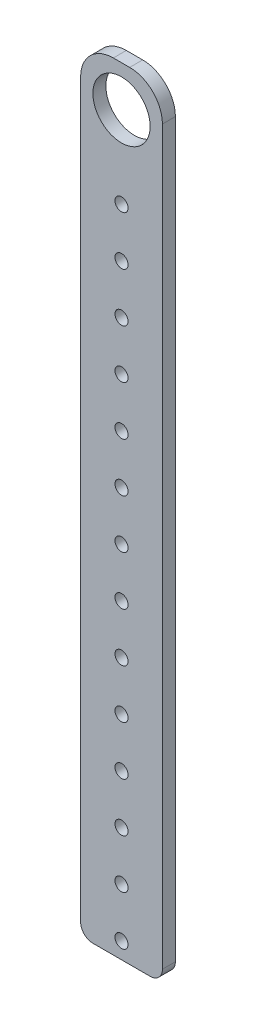
ISO-10303-21;
HEADER;
FILE_DESCRIPTION(('STEP AP214'),'2;1');
FILE_NAME('part.step','',(''),(''),'','','');
FILE_SCHEMA(('AUTOMOTIVE_DESIGN { 1 0 10303 214 1 1 1 1 }'));
ENDSEC;
DATA;
#1=APPLICATION_CONTEXT('core data for automotive mechanical design processes');
#2=APPLICATION_PROTOCOL_DEFINITION('international standard','automotive_design',2000,#1);
#3=PRODUCT_CONTEXT('',#1,'mechanical');
#4=PRODUCT('Part','Part','',(#3));
#5=PRODUCT_RELATED_PRODUCT_CATEGORY('part','',(#4));
#6=PRODUCT_DEFINITION_FORMATION('','',#4);
#7=PRODUCT_DEFINITION_CONTEXT('part definition',#1,'design');
#8=PRODUCT_DEFINITION('design','',#6,#7);
#9=PRODUCT_DEFINITION_SHAPE('','',#8);
#10=(LENGTH_UNIT() NAMED_UNIT(*) SI_UNIT(.MILLI.,.METRE.));
#11=(NAMED_UNIT(*) PLANE_ANGLE_UNIT() SI_UNIT($,.RADIAN.));
#12=(NAMED_UNIT(*) SI_UNIT($,.STERADIAN.) SOLID_ANGLE_UNIT());
#13=UNCERTAINTY_MEASURE_WITH_UNIT(LENGTH_MEASURE(1.E-05),#10,'distance_accuracy_value','');
#14=(GEOMETRIC_REPRESENTATION_CONTEXT(3) GLOBAL_UNCERTAINTY_ASSIGNED_CONTEXT((#13)) GLOBAL_UNIT_ASSIGNED_CONTEXT((#10,
#11,#12)) REPRESENTATION_CONTEXT('',''));
#15=CARTESIAN_POINT('',(0.,0.,0.));
#16=DIRECTION('',(0.,0.,1.));
#17=DIRECTION('',(1.,0.,0.));
#18=AXIS2_PLACEMENT_3D('',#15,#16,#17);
#19=CARTESIAN_POINT('',(0.,0.,3.175));
#20=DIRECTION('',(0.,0.,-1.));
#21=DIRECTION('',(-1.,0.,0.));
#22=AXIS2_PLACEMENT_3D('',#19,#20,#21);
#23=PLANE('',#22);
#24=DIRECTION('',(0.,1.,0.));
#25=VECTOR('',#24,1.);
#26=CARTESIAN_POINT('',(9.99999999999996,-95.0000000000001,3.175));
#27=LINE('',#26,#25);
#28=CARTESIAN_POINT('',(9.99999999999996,-92.0000000000001,3.175));
#29=VERTEX_POINT('',#28);
#30=CARTESIAN_POINT('',(10.,86.9999999999999,3.175));
#31=VERTEX_POINT('',#30);
#32=EDGE_CURVE('E130',#29,#31,#27,.T.);
#33=ORIENTED_EDGE('',*,*,#32,.T.);
#34=CARTESIAN_POINT('',(2.00000000000002,86.9999999999999,3.175));
#35=DIRECTION('',(0.,0.,-1.));
#36=DIRECTION('',(-1.,0.,0.));
#37=AXIS2_PLACEMENT_3D('',#34,#35,#36);
#38=CIRCLE('',#37,8.);
#39=CARTESIAN_POINT('',(2.00000000000001,94.9999999999999,3.175));
#40=VERTEX_POINT('',#39);
#41=EDGE_CURVE('E54',#31,#40,#38,.F.);
#42=ORIENTED_EDGE('',*,*,#41,.T.);
#43=DIRECTION('',(-1.,0.,0.));
#44=VECTOR('',#43,1.);
#45=CARTESIAN_POINT('',(-10.,94.9999999999999,3.175));
#46=LINE('',#45,#44);
#47=CARTESIAN_POINT('',(-2.00000000000002,94.9999999999999,3.175));
#48=VERTEX_POINT('',#47);
#49=EDGE_CURVE('E195',#40,#48,#46,.T.);
#50=ORIENTED_EDGE('',*,*,#49,.T.);
#51=CARTESIAN_POINT('',(-2.00000000000002,86.9999999999999,3.175));
#52=DIRECTION('',(0.,0.,-1.));
#53=DIRECTION('',(-1.,0.,0.));
#54=AXIS2_PLACEMENT_3D('',#51,#52,#53);
#55=CIRCLE('',#54,8.);
#56=CARTESIAN_POINT('',(-10.,86.9999999999999,3.175));
#57=VERTEX_POINT('',#56);
#58=EDGE_CURVE('E61',#48,#57,#55,.F.);
#59=ORIENTED_EDGE('',*,*,#58,.T.);
#60=DIRECTION('',(0.,-1.,0.));
#61=VECTOR('',#60,1.);
#62=CARTESIAN_POINT('',(-10.,-95.0000000000001,3.175));
#63=LINE('',#62,#61);
#64=CARTESIAN_POINT('',(-10.,-92.0000000000001,3.175));
#65=VERTEX_POINT('',#64);
#66=EDGE_CURVE('E202',#57,#65,#63,.T.);
#67=ORIENTED_EDGE('',*,*,#66,.T.);
#68=CARTESIAN_POINT('',(-7.00000000000004,-92.0000000000001,3.175));
#69=DIRECTION('',(0.,0.,-1.));
#70=DIRECTION('',(-1.,0.,0.));
#71=AXIS2_PLACEMENT_3D('',#68,#69,#70);
#72=CIRCLE('',#71,3.);
#73=CARTESIAN_POINT('',(-7.00000000000004,-95.0000000000001,3.175));
#74=VERTEX_POINT('',#73);
#75=EDGE_CURVE('E166',#65,#74,#72,.F.);
#76=ORIENTED_EDGE('',*,*,#75,.T.);
#77=DIRECTION('',(1.,0.,0.));
#78=VECTOR('',#77,1.);
#79=CARTESIAN_POINT('',(-10.,-95.0000000000001,3.175));
#80=LINE('',#79,#78);
#81=CARTESIAN_POINT('',(6.99999999999996,-95.0000000000001,3.175));
#82=VERTEX_POINT('',#81);
#83=EDGE_CURVE('E132',#74,#82,#80,.T.);
#84=ORIENTED_EDGE('',*,*,#83,.T.);
#85=CARTESIAN_POINT('',(6.99999999999996,-92.0000000000001,3.175));
#86=DIRECTION('',(0.,0.,-1.));
#87=DIRECTION('',(-1.,0.,0.));
#88=AXIS2_PLACEMENT_3D('',#85,#86,#87);
#89=CIRCLE('',#88,3.);
#90=EDGE_CURVE('E169',#82,#29,#89,.F.);
#91=ORIENTED_EDGE('',*,*,#90,.T.);
#92=EDGE_LOOP('',(#33,#42,#50,#59,#67,#76,#84,#91));
#93=FACE_BOUND('',#92,.T.);
#94=CARTESIAN_POINT('',(0.,84.9999999999999,3.175));
#95=DIRECTION('',(0.,0.,1.));
#96=DIRECTION('',(1.,0.,0.));
#97=AXIS2_PLACEMENT_3D('',#94,#95,#96);
#98=CIRCLE('',#97,7.);
#99=CARTESIAN_POINT('',(7.,84.9999999999999,3.175));
#100=VERTEX_POINT('',#99);
#101=EDGE_CURVE('E140',#100,#100,#98,.T.);
#102=ORIENTED_EDGE('',*,*,#101,.F.);
#103=EDGE_LOOP('',(#102));
#104=FACE_BOUND('',#103,.T.);
#105=CARTESIAN_POINT('',(-2.65589510718706E-13,-7.0000000000001,3.175));
#106=DIRECTION('',(0.,0.,1.));
#107=DIRECTION('',(1.,0.,0.));
#108=AXIS2_PLACEMENT_3D('',#105,#106,#107);
#109=CIRCLE('',#108,1.6);
#110=CARTESIAN_POINT('',(1.59999999999973,-7.0000000000001,3.175));
#111=VERTEX_POINT('',#110);
#112=EDGE_CURVE('E306',#111,#111,#109,.T.);
#113=ORIENTED_EDGE('',*,*,#112,.F.);
#114=EDGE_LOOP('',(#113));
#115=FACE_BOUND('',#114,.T.);
#116=CARTESIAN_POINT('',(-2.24426522732077E-13,-19.0000000000001,3.175));
#117=DIRECTION('',(0.,0.,1.));
#118=DIRECTION('',(1.,0.,0.));
#119=AXIS2_PLACEMENT_3D('',#116,#117,#118);
#120=CIRCLE('',#119,1.6);
#121=CARTESIAN_POINT('',(1.59999999999977,-19.0000000000001,3.175));
#122=VERTEX_POINT('',#121);
#123=EDGE_CURVE('E312',#122,#122,#120,.T.);
#124=ORIENTED_EDGE('',*,*,#123,.F.);
#125=EDGE_LOOP('',(#124));
#126=FACE_BOUND('',#125,.T.);
#127=CARTESIAN_POINT('',(-3.06752498705335E-13,4.99999999999989,3.175));
#128=DIRECTION('',(0.,0.,1.));
#129=DIRECTION('',(1.,0.,0.));
#130=AXIS2_PLACEMENT_3D('',#127,#128,#129);
#131=CIRCLE('',#130,1.6);
#132=CARTESIAN_POINT('',(1.59999999999969,4.99999999999989,3.175));
#133=VERTEX_POINT('',#132);
#134=EDGE_CURVE('E441',#133,#133,#131,.T.);
#135=ORIENTED_EDGE('',*,*,#134,.F.);
#136=EDGE_LOOP('',(#135));
#137=FACE_BOUND('',#136,.T.);
#138=CARTESIAN_POINT('',(-3.47915486691964E-13,16.9999999999999,3.175));
#139=DIRECTION('',(0.,0.,1.));
#140=DIRECTION('',(1.,0.,0.));
#141=AXIS2_PLACEMENT_3D('',#138,#139,#140);
#142=CIRCLE('',#141,1.6);
#143=CARTESIAN_POINT('',(1.59999999999965,16.9999999999999,3.175));
#144=VERTEX_POINT('',#143);
#145=EDGE_CURVE('E434',#144,#144,#142,.T.);
#146=ORIENTED_EDGE('',*,*,#145,.F.);
#147=EDGE_LOOP('',(#146));
#148=FACE_BOUND('',#147,.T.);
#149=CARTESIAN_POINT('',(-3.89078474678593E-13,28.9999999999999,3.175));
#150=DIRECTION('',(0.,0.,1.));
#151=DIRECTION('',(1.,0.,0.));
#152=AXIS2_PLACEMENT_3D('',#149,#150,#151);
#153=CIRCLE('',#152,1.6);
#154=CARTESIAN_POINT('',(1.59999999999961,28.9999999999999,3.175));
#155=VERTEX_POINT('',#154);
#156=EDGE_CURVE('E427',#155,#155,#153,.T.);
#157=ORIENTED_EDGE('',*,*,#156,.F.);
#158=EDGE_LOOP('',(#157));
#159=FACE_BOUND('',#158,.T.);
#160=CARTESIAN_POINT('',(-4.30241462665223E-13,40.9999999999999,3.175));
#161=DIRECTION('',(0.,0.,1.));
#162=DIRECTION('',(1.,0.,0.));
#163=AXIS2_PLACEMENT_3D('',#160,#161,#162);
#164=CIRCLE('',#163,1.6);
#165=CARTESIAN_POINT('',(1.59999999999957,40.9999999999999,3.175));
#166=VERTEX_POINT('',#165);
#167=EDGE_CURVE('E420',#166,#166,#164,.T.);
#168=ORIENTED_EDGE('',*,*,#167,.F.);
#169=EDGE_LOOP('',(#168));
#170=FACE_BOUND('',#169,.T.);
#171=CARTESIAN_POINT('',(-4.71404450651852E-13,52.9999999999999,3.175));
#172=DIRECTION('',(0.,0.,1.));
#173=DIRECTION('',(1.,0.,0.));
#174=AXIS2_PLACEMENT_3D('',#171,#172,#173);
#175=CIRCLE('',#174,1.6);
#176=CARTESIAN_POINT('',(1.59999999999953,52.9999999999999,3.175));
#177=VERTEX_POINT('',#176);
#178=EDGE_CURVE('E413',#177,#177,#175,.T.);
#179=ORIENTED_EDGE('',*,*,#178,.F.);
#180=EDGE_LOOP('',(#179));
#181=FACE_BOUND('',#180,.T.);
#182=CARTESIAN_POINT('',(-5.12567438638481E-13,64.9999999999999,3.175));
#183=DIRECTION('',(0.,0.,1.));
#184=DIRECTION('',(1.,0.,0.));
#185=AXIS2_PLACEMENT_3D('',#182,#183,#184);
#186=CIRCLE('',#185,1.6);
#187=CARTESIAN_POINT('',(1.59999999999949,64.9999999999999,3.175));
#188=VERTEX_POINT('',#187);
#189=EDGE_CURVE('E406',#188,#188,#186,.T.);
#190=ORIENTED_EDGE('',*,*,#189,.F.);
#191=EDGE_LOOP('',(#190));
#192=FACE_BOUND('',#191,.T.);
#193=CARTESIAN_POINT('',(0.,-91.0000000000001,3.175));
#194=DIRECTION('',(0.,0.,1.));
#195=DIRECTION('',(1.,0.,0.));
#196=AXIS2_PLACEMENT_3D('',#193,#194,#195);
#197=CIRCLE('',#196,1.6);
#198=CARTESIAN_POINT('',(1.60000000000003,-91.0000000000001,3.175));
#199=VERTEX_POINT('',#198);
#200=EDGE_CURVE('E399',#199,#199,#197,.T.);
#201=ORIENTED_EDGE('',*,*,#200,.F.);
#202=EDGE_LOOP('',(#201));
#203=FACE_BOUND('',#202,.T.);
#204=CARTESIAN_POINT('',(0.,-79.0000000000001,3.175));
#205=DIRECTION('',(0.,0.,1.));
#206=DIRECTION('',(1.,0.,0.));
#207=AXIS2_PLACEMENT_3D('',#204,#205,#206);
#208=CIRCLE('',#207,1.6);
#209=CARTESIAN_POINT('',(1.59999999999998,-79.0000000000001,3.175));
#210=VERTEX_POINT('',#209);
#211=EDGE_CURVE('E392',#210,#210,#208,.T.);
#212=ORIENTED_EDGE('',*,*,#211,.F.);
#213=EDGE_LOOP('',(#212));
#214=FACE_BOUND('',#213,.T.);
#215=CARTESIAN_POINT('',(0.,-67.0000000000001,3.175));
#216=DIRECTION('',(0.,0.,1.));
#217=DIRECTION('',(1.,0.,0.));
#218=AXIS2_PLACEMENT_3D('',#215,#216,#217);
#219=CIRCLE('',#218,1.6);
#220=CARTESIAN_POINT('',(1.59999999999994,-67.0000000000001,3.175));
#221=VERTEX_POINT('',#220);
#222=EDGE_CURVE('E385',#221,#221,#219,.T.);
#223=ORIENTED_EDGE('',*,*,#222,.F.);
#224=EDGE_LOOP('',(#223));
#225=FACE_BOUND('',#224,.T.);
#226=CARTESIAN_POINT('',(-1.00937558772189E-13,-55.0000000000001,3.175));
#227=DIRECTION('',(0.,0.,1.));
#228=DIRECTION('',(1.,0.,0.));
#229=AXIS2_PLACEMENT_3D('',#226,#227,#228);
#230=CIRCLE('',#229,1.6);
#231=CARTESIAN_POINT('',(1.5999999999999,-55.0000000000001,3.175));
#232=VERTEX_POINT('',#231);
#233=EDGE_CURVE('E378',#232,#232,#230,.T.);
#234=ORIENTED_EDGE('',*,*,#233,.F.);
#235=EDGE_LOOP('',(#234));
#236=FACE_BOUND('',#235,.T.);
#237=CARTESIAN_POINT('',(-1.42100546758818E-13,-43.0000000000001,3.175));
#238=DIRECTION('',(0.,0.,1.));
#239=DIRECTION('',(1.,0.,0.));
#240=AXIS2_PLACEMENT_3D('',#237,#238,#239);
#241=CIRCLE('',#240,1.6);
#242=CARTESIAN_POINT('',(1.59999999999985,-43.0000000000001,3.175));
#243=VERTEX_POINT('',#242);
#244=EDGE_CURVE('E371',#243,#243,#241,.T.);
#245=ORIENTED_EDGE('',*,*,#244,.F.);
#246=EDGE_LOOP('',(#245));
#247=FACE_BOUND('',#246,.T.);
#248=CARTESIAN_POINT('',(-1.83263534745447E-13,-31.0000000000001,3.175));
#249=DIRECTION('',(0.,0.,1.));
#250=DIRECTION('',(1.,0.,0.));
#251=AXIS2_PLACEMENT_3D('',#248,#249,#250);
#252=CIRCLE('',#251,1.6);
#253=CARTESIAN_POINT('',(1.59999999999982,-31.0000000000001,3.175));
#254=VERTEX_POINT('',#253);
#255=EDGE_CURVE('E365',#254,#254,#252,.T.);
#256=ORIENTED_EDGE('',*,*,#255,.F.);
#257=EDGE_LOOP('',(#256));
#258=FACE_BOUND('',#257,.T.);
#259=ADVANCED_FACE('F45',(#93,#104,#115,#126,#137,#148,#159,#170,#181,#192,#203,#214,#225,#236,
#247,#258),#23,.F.);
#260=CARTESIAN_POINT('',(0.,0.,0.));
#261=DIRECTION('',(0.,0.,-1.));
#262=DIRECTION('',(-1.,0.,0.));
#263=AXIS2_PLACEMENT_3D('',#260,#261,#262);
#264=PLANE('',#263);
#265=CARTESIAN_POINT('',(-1.42100546758818E-13,-43.0000000000001,0.));
#266=DIRECTION('',(0.,0.,1.));
#267=DIRECTION('',(1.,0.,0.));
#268=AXIS2_PLACEMENT_3D('',#265,#266,#267);
#269=CIRCLE('',#268,1.6);
#270=CARTESIAN_POINT('',(1.59999999999985,-43.0000000000001,0.));
#271=VERTEX_POINT('',#270);
#272=EDGE_CURVE('E368',#271,#271,#269,.T.);
#273=ORIENTED_EDGE('',*,*,#272,.T.);
#274=EDGE_LOOP('',(#273));
#275=FACE_BOUND('',#274,.T.);
#276=CARTESIAN_POINT('',(0.,-67.0000000000001,0.));
#277=DIRECTION('',(0.,0.,1.));
#278=DIRECTION('',(1.,0.,0.));
#279=AXIS2_PLACEMENT_3D('',#276,#277,#278);
#280=CIRCLE('',#279,1.6);
#281=CARTESIAN_POINT('',(1.59999999999994,-67.0000000000001,0.));
#282=VERTEX_POINT('',#281);
#283=EDGE_CURVE('E382',#282,#282,#280,.T.);
#284=ORIENTED_EDGE('',*,*,#283,.T.);
#285=EDGE_LOOP('',(#284));
#286=FACE_BOUND('',#285,.T.);
#287=CARTESIAN_POINT('',(0.,-91.0000000000001,0.));
#288=DIRECTION('',(0.,0.,1.));
#289=DIRECTION('',(1.,0.,0.));
#290=AXIS2_PLACEMENT_3D('',#287,#288,#289);
#291=CIRCLE('',#290,1.6);
#292=CARTESIAN_POINT('',(1.60000000000003,-91.0000000000001,0.));
#293=VERTEX_POINT('',#292);
#294=EDGE_CURVE('E396',#293,#293,#291,.T.);
#295=ORIENTED_EDGE('',*,*,#294,.T.);
#296=EDGE_LOOP('',(#295));
#297=FACE_BOUND('',#296,.T.);
#298=CARTESIAN_POINT('',(-4.71404450651852E-13,52.9999999999999,0.));
#299=DIRECTION('',(0.,0.,1.));
#300=DIRECTION('',(1.,0.,0.));
#301=AXIS2_PLACEMENT_3D('',#298,#299,#300);
#302=CIRCLE('',#301,1.6);
#303=CARTESIAN_POINT('',(1.59999999999953,52.9999999999999,0.));
#304=VERTEX_POINT('',#303);
#305=EDGE_CURVE('E410',#304,#304,#302,.T.);
#306=ORIENTED_EDGE('',*,*,#305,.T.);
#307=EDGE_LOOP('',(#306));
#308=FACE_BOUND('',#307,.T.);
#309=CARTESIAN_POINT('',(-3.89078474678593E-13,28.9999999999999,0.));
#310=DIRECTION('',(0.,0.,1.));
#311=DIRECTION('',(1.,0.,0.));
#312=AXIS2_PLACEMENT_3D('',#309,#310,#311);
#313=CIRCLE('',#312,1.6);
#314=CARTESIAN_POINT('',(1.59999999999961,28.9999999999999,0.));
#315=VERTEX_POINT('',#314);
#316=EDGE_CURVE('E424',#315,#315,#313,.T.);
#317=ORIENTED_EDGE('',*,*,#316,.T.);
#318=EDGE_LOOP('',(#317));
#319=FACE_BOUND('',#318,.T.);
#320=CARTESIAN_POINT('',(-3.06752498705335E-13,4.99999999999989,0.));
#321=DIRECTION('',(0.,0.,1.));
#322=DIRECTION('',(1.,0.,0.));
#323=AXIS2_PLACEMENT_3D('',#320,#321,#322);
#324=CIRCLE('',#323,1.6);
#325=CARTESIAN_POINT('',(1.59999999999969,4.99999999999989,0.));
#326=VERTEX_POINT('',#325);
#327=EDGE_CURVE('E438',#326,#326,#324,.T.);
#328=ORIENTED_EDGE('',*,*,#327,.T.);
#329=EDGE_LOOP('',(#328));
#330=FACE_BOUND('',#329,.T.);
#331=CARTESIAN_POINT('',(-2.65589510718706E-13,-7.0000000000001,0.));
#332=DIRECTION('',(0.,0.,1.));
#333=DIRECTION('',(1.,0.,0.));
#334=AXIS2_PLACEMENT_3D('',#331,#332,#333);
#335=CIRCLE('',#334,1.6);
#336=CARTESIAN_POINT('',(1.59999999999973,-7.0000000000001,0.));
#337=VERTEX_POINT('',#336);
#338=EDGE_CURVE('E309',#337,#337,#335,.T.);
#339=ORIENTED_EDGE('',*,*,#338,.T.);
#340=EDGE_LOOP('',(#339));
#341=FACE_BOUND('',#340,.T.);
#342=DIRECTION('',(-1.,0.,0.));
#343=VECTOR('',#342,1.);
#344=CARTESIAN_POINT('',(-10.,94.9999999999999,0.));
#345=LINE('',#344,#343);
#346=CARTESIAN_POINT('',(2.00000000000001,94.9999999999999,0.));
#347=VERTEX_POINT('',#346);
#348=CARTESIAN_POINT('',(-2.00000000000002,94.9999999999999,0.));
#349=VERTEX_POINT('',#348);
#350=EDGE_CURVE('E139',#347,#349,#345,.T.);
#351=ORIENTED_EDGE('',*,*,#350,.F.);
#352=CARTESIAN_POINT('',(2.00000000000002,86.9999999999999,0.));
#353=DIRECTION('',(0.,0.,-1.));
#354=DIRECTION('',(-1.,0.,0.));
#355=AXIS2_PLACEMENT_3D('',#352,#353,#354);
#356=CIRCLE('',#355,8.);
#357=CARTESIAN_POINT('',(10.,86.9999999999999,0.));
#358=VERTEX_POINT('',#357);
#359=EDGE_CURVE('E137',#347,#358,#356,.T.);
#360=ORIENTED_EDGE('',*,*,#359,.T.);
#361=DIRECTION('',(0.,1.,0.));
#362=VECTOR('',#361,1.);
#363=CARTESIAN_POINT('',(9.99999999999996,-95.0000000000001,0.));
#364=LINE('',#363,#362);
#365=CARTESIAN_POINT('',(9.99999999999996,-92.0000000000001,0.));
#366=VERTEX_POINT('',#365);
#367=EDGE_CURVE('E129',#366,#358,#364,.T.);
#368=ORIENTED_EDGE('',*,*,#367,.F.);
#369=CARTESIAN_POINT('',(6.99999999999996,-92.0000000000001,0.));
#370=DIRECTION('',(0.,0.,-1.));
#371=DIRECTION('',(-1.,0.,0.));
#372=AXIS2_PLACEMENT_3D('',#369,#370,#371);
#373=CIRCLE('',#372,3.);
#374=CARTESIAN_POINT('',(6.99999999999996,-95.0000000000001,0.));
#375=VERTEX_POINT('',#374);
#376=EDGE_CURVE('E114',#366,#375,#373,.T.);
#377=ORIENTED_EDGE('',*,*,#376,.T.);
#378=DIRECTION('',(1.,0.,0.));
#379=VECTOR('',#378,1.);
#380=CARTESIAN_POINT('',(-10.,-95.0000000000001,0.));
#381=LINE('',#380,#379);
#382=CARTESIAN_POINT('',(-7.00000000000004,-95.0000000000001,0.));
#383=VERTEX_POINT('',#382);
#384=EDGE_CURVE('E155',#383,#375,#381,.T.);
#385=ORIENTED_EDGE('',*,*,#384,.F.);
#386=CARTESIAN_POINT('',(-7.00000000000004,-92.0000000000001,0.));
#387=DIRECTION('',(0.,0.,-1.));
#388=DIRECTION('',(-1.,0.,0.));
#389=AXIS2_PLACEMENT_3D('',#386,#387,#388);
#390=CIRCLE('',#389,3.);
#391=CARTESIAN_POINT('',(-10.,-92.0000000000001,0.));
#392=VERTEX_POINT('',#391);
#393=EDGE_CURVE('E126',#383,#392,#390,.T.);
#394=ORIENTED_EDGE('',*,*,#393,.T.);
#395=DIRECTION('',(0.,-1.,0.));
#396=VECTOR('',#395,1.);
#397=CARTESIAN_POINT('',(-10.,-95.0000000000001,0.));
#398=LINE('',#397,#396);
#399=CARTESIAN_POINT('',(-10.,86.9999999999999,0.));
#400=VERTEX_POINT('',#399);
#401=EDGE_CURVE('E145',#400,#392,#398,.T.);
#402=ORIENTED_EDGE('',*,*,#401,.F.);
#403=CARTESIAN_POINT('',(-2.00000000000002,86.9999999999999,0.));
#404=DIRECTION('',(0.,0.,-1.));
#405=DIRECTION('',(-1.,0.,0.));
#406=AXIS2_PLACEMENT_3D('',#403,#404,#405);
#407=CIRCLE('',#406,8.);
#408=EDGE_CURVE('E183',#400,#349,#407,.T.);
#409=ORIENTED_EDGE('',*,*,#408,.T.);
#410=EDGE_LOOP('',(#351,#360,#368,#377,#385,#394,#402,#409));
#411=FACE_BOUND('',#410,.T.);
#412=CARTESIAN_POINT('',(0.,84.9999999999999,0.));
#413=DIRECTION('',(0.,0.,1.));
#414=DIRECTION('',(1.,0.,0.));
#415=AXIS2_PLACEMENT_3D('',#412,#413,#414);
#416=CIRCLE('',#415,7.);
#417=CARTESIAN_POINT('',(7.,84.9999999999999,0.));
#418=VERTEX_POINT('',#417);
#419=EDGE_CURVE('E148',#418,#418,#416,.T.);
#420=ORIENTED_EDGE('',*,*,#419,.T.);
#421=EDGE_LOOP('',(#420));
#422=FACE_BOUND('',#421,.T.);
#423=CARTESIAN_POINT('',(-2.24426522732077E-13,-19.0000000000001,0.));
#424=DIRECTION('',(0.,0.,1.));
#425=DIRECTION('',(1.,0.,0.));
#426=AXIS2_PLACEMENT_3D('',#423,#424,#425);
#427=CIRCLE('',#426,1.6);
#428=CARTESIAN_POINT('',(1.59999999999977,-19.0000000000001,0.));
#429=VERTEX_POINT('',#428);
#430=EDGE_CURVE('E318',#429,#429,#427,.T.);
#431=ORIENTED_EDGE('',*,*,#430,.T.);
#432=EDGE_LOOP('',(#431));
#433=FACE_BOUND('',#432,.T.);
#434=CARTESIAN_POINT('',(-3.47915486691964E-13,16.9999999999999,0.));
#435=DIRECTION('',(0.,0.,1.));
#436=DIRECTION('',(1.,0.,0.));
#437=AXIS2_PLACEMENT_3D('',#434,#435,#436);
#438=CIRCLE('',#437,1.6);
#439=CARTESIAN_POINT('',(1.59999999999965,16.9999999999999,0.));
#440=VERTEX_POINT('',#439);
#441=EDGE_CURVE('E344',#440,#440,#438,.T.);
#442=ORIENTED_EDGE('',*,*,#441,.T.);
#443=EDGE_LOOP('',(#442));
#444=FACE_BOUND('',#443,.T.);
#445=CARTESIAN_POINT('',(-4.30241462665223E-13,40.9999999999999,0.));
#446=DIRECTION('',(0.,0.,1.));
#447=DIRECTION('',(1.,0.,0.));
#448=AXIS2_PLACEMENT_3D('',#445,#446,#447);
#449=CIRCLE('',#448,1.6);
#450=CARTESIAN_POINT('',(1.59999999999957,40.9999999999999,0.));
#451=VERTEX_POINT('',#450);
#452=EDGE_CURVE('E348',#451,#451,#449,.T.);
#453=ORIENTED_EDGE('',*,*,#452,.T.);
#454=EDGE_LOOP('',(#453));
#455=FACE_BOUND('',#454,.T.);
#456=CARTESIAN_POINT('',(-5.12567438638481E-13,64.9999999999999,0.));
#457=DIRECTION('',(0.,0.,1.));
#458=DIRECTION('',(1.,0.,0.));
#459=AXIS2_PLACEMENT_3D('',#456,#457,#458);
#460=CIRCLE('',#459,1.6);
#461=CARTESIAN_POINT('',(1.59999999999949,64.9999999999999,0.));
#462=VERTEX_POINT('',#461);
#463=EDGE_CURVE('E352',#462,#462,#460,.T.);
#464=ORIENTED_EDGE('',*,*,#463,.T.);
#465=EDGE_LOOP('',(#464));
#466=FACE_BOUND('',#465,.T.);
#467=CARTESIAN_POINT('',(0.,-79.0000000000001,0.));
#468=DIRECTION('',(0.,0.,1.));
#469=DIRECTION('',(1.,0.,0.));
#470=AXIS2_PLACEMENT_3D('',#467,#468,#469);
#471=CIRCLE('',#470,1.6);
#472=CARTESIAN_POINT('',(1.59999999999998,-79.0000000000001,0.));
#473=VERTEX_POINT('',#472);
#474=EDGE_CURVE('E356',#473,#473,#471,.T.);
#475=ORIENTED_EDGE('',*,*,#474,.T.);
#476=EDGE_LOOP('',(#475));
#477=FACE_BOUND('',#476,.T.);
#478=CARTESIAN_POINT('',(-1.00937558772189E-13,-55.0000000000001,0.));
#479=DIRECTION('',(0.,0.,1.));
#480=DIRECTION('',(1.,0.,0.));
#481=AXIS2_PLACEMENT_3D('',#478,#479,#480);
#482=CIRCLE('',#481,1.6);
#483=CARTESIAN_POINT('',(1.5999999999999,-55.0000000000001,0.));
#484=VERTEX_POINT('',#483);
#485=EDGE_CURVE('E360',#484,#484,#482,.T.);
#486=ORIENTED_EDGE('',*,*,#485,.T.);
#487=EDGE_LOOP('',(#486));
#488=FACE_BOUND('',#487,.T.);
#489=CARTESIAN_POINT('',(-1.83263534745447E-13,-31.0000000000001,0.));
#490=DIRECTION('',(0.,0.,1.));
#491=DIRECTION('',(1.,0.,0.));
#492=AXIS2_PLACEMENT_3D('',#489,#490,#491);
#493=CIRCLE('',#492,1.6);
#494=CARTESIAN_POINT('',(1.59999999999982,-31.0000000000001,0.));
#495=VERTEX_POINT('',#494);
#496=EDGE_CURVE('E363',#495,#495,#493,.T.);
#497=ORIENTED_EDGE('',*,*,#496,.T.);
#498=EDGE_LOOP('',(#497));
#499=FACE_BOUND('',#498,.T.);
#500=ADVANCED_FACE('F135',(#275,#286,#297,#308,#319,#330,#341,#411,#422,#433,#444,#455,#466,
#477,#488,#499),#264,.T.);
#501=CARTESIAN_POINT('',(9.99999999999996,-95.0000000000001,3.175));
#502=DIRECTION('',(-1.,0.,0.));
#503=DIRECTION('',(0.,-1.,0.));
#504=AXIS2_PLACEMENT_3D('',#501,#502,#503);
#505=PLANE('',#504);
#506=ORIENTED_EDGE('',*,*,#367,.T.);
#507=DIRECTION('',(0.,0.,-1.));
#508=VECTOR('',#507,1.);
#509=CARTESIAN_POINT('',(10.,86.9999999999999,3.175));
#510=LINE('',#509,#508);
#511=EDGE_CURVE('E69',#358,#31,#510,.F.);
#512=ORIENTED_EDGE('',*,*,#511,.T.);
#513=ORIENTED_EDGE('',*,*,#32,.F.);
#514=DIRECTION('',(0.,0.,-1.));
#515=VECTOR('',#514,1.);
#516=CARTESIAN_POINT('',(9.99999999999996,-92.0000000000001,3.175));
#517=LINE('',#516,#515);
#518=EDGE_CURVE('E118',#29,#366,#517,.T.);
#519=ORIENTED_EDGE('',*,*,#518,.T.);
#520=EDGE_LOOP('',(#506,#512,#513,#519));
#521=FACE_BOUND('',#520,.T.);
#522=ADVANCED_FACE('F128',(#521),#505,.F.);
#523=CARTESIAN_POINT('',(-10.,94.9999999999999,3.175));
#524=DIRECTION('',(0.,-1.,0.));
#525=DIRECTION('',(0.,0.,-1.));
#526=AXIS2_PLACEMENT_3D('',#523,#524,#525);
#527=PLANE('',#526);
#528=ORIENTED_EDGE('',*,*,#49,.F.);
#529=DIRECTION('',(0.,0.,-1.));
#530=VECTOR('',#529,1.);
#531=CARTESIAN_POINT('',(2.00000000000002,94.9999999999999,3.175));
#532=LINE('',#531,#530);
#533=EDGE_CURVE('E179',#40,#347,#532,.T.);
#534=ORIENTED_EDGE('',*,*,#533,.T.);
#535=ORIENTED_EDGE('',*,*,#350,.T.);
#536=DIRECTION('',(0.,0.,-1.));
#537=VECTOR('',#536,1.);
#538=CARTESIAN_POINT('',(-2.00000000000002,94.9999999999999,3.175));
#539=LINE('',#538,#537);
#540=EDGE_CURVE('E176',#349,#48,#539,.F.);
#541=ORIENTED_EDGE('',*,*,#540,.T.);
#542=EDGE_LOOP('',(#528,#534,#535,#541));
#543=FACE_BOUND('',#542,.T.);
#544=ADVANCED_FACE('F199',(#543),#527,.F.);
#545=CARTESIAN_POINT('',(-10.,-95.0000000000001,3.175));
#546=DIRECTION('',(1.,0.,0.));
#547=DIRECTION('',(0.,1.,0.));
#548=AXIS2_PLACEMENT_3D('',#545,#546,#547);
#549=PLANE('',#548);
#550=ORIENTED_EDGE('',*,*,#66,.F.);
#551=DIRECTION('',(0.,0.,-1.));
#552=VECTOR('',#551,1.);
#553=CARTESIAN_POINT('',(-10.,86.9999999999999,3.175));
#554=LINE('',#553,#552);
#555=EDGE_CURVE('E11',#57,#400,#554,.T.);
#556=ORIENTED_EDGE('',*,*,#555,.T.);
#557=ORIENTED_EDGE('',*,*,#401,.T.);
#558=DIRECTION('',(0.,0.,-1.));
#559=VECTOR('',#558,1.);
#560=CARTESIAN_POINT('',(-10.,-92.0000000000001,3.175));
#561=LINE('',#560,#559);
#562=EDGE_CURVE('E172',#392,#65,#561,.F.);
#563=ORIENTED_EDGE('',*,*,#562,.T.);
#564=EDGE_LOOP('',(#550,#556,#557,#563));
#565=FACE_BOUND('',#564,.T.);
#566=ADVANCED_FACE('F229',(#565),#549,.F.);
#567=CARTESIAN_POINT('',(-10.,-95.0000000000001,3.175));
#568=DIRECTION('',(0.,1.,0.));
#569=DIRECTION('',(0.,0.,1.));
#570=AXIS2_PLACEMENT_3D('',#567,#568,#569);
#571=PLANE('',#570);
#572=ORIENTED_EDGE('',*,*,#384,.T.);
#573=DIRECTION('',(0.,0.,-1.));
#574=VECTOR('',#573,1.);
#575=CARTESIAN_POINT('',(6.99999999999996,-95.0000000000001,3.175));
#576=LINE('',#575,#574);
#577=EDGE_CURVE('E119',#375,#82,#576,.F.);
#578=ORIENTED_EDGE('',*,*,#577,.T.);
#579=ORIENTED_EDGE('',*,*,#83,.F.);
#580=DIRECTION('',(0.,0.,-1.));
#581=VECTOR('',#580,1.);
#582=CARTESIAN_POINT('',(-7.00000000000004,-95.0000000000001,3.175));
#583=LINE('',#582,#581);
#584=EDGE_CURVE('E125',#74,#383,#583,.T.);
#585=ORIENTED_EDGE('',*,*,#584,.T.);
#586=EDGE_LOOP('',(#572,#578,#579,#585));
#587=FACE_BOUND('',#586,.T.);
#588=ADVANCED_FACE('F226',(#587),#571,.F.);
#589=CARTESIAN_POINT('',(0.,84.9999999999999,3.175));
#590=DIRECTION('',(0.,0.,-1.));
#591=DIRECTION('',(-1.,0.,0.));
#592=AXIS2_PLACEMENT_3D('',#589,#590,#591);
#593=CYLINDRICAL_SURFACE('',#592,7.);
#594=ORIENTED_EDGE('',*,*,#101,.T.);
#595=EDGE_LOOP('',(#594));
#596=FACE_BOUND('',#595,.T.);
#597=ORIENTED_EDGE('',*,*,#419,.F.);
#598=EDGE_LOOP('',(#597));
#599=FACE_BOUND('',#598,.T.);
#600=ADVANCED_FACE('F223',(#596,#599),#593,.F.);
#601=CARTESIAN_POINT('',(-2.65589510718706E-13,-7.0000000000001,3.175));
#602=DIRECTION('',(0.,0.,-1.));
#603=DIRECTION('',(-1.,0.,0.));
#604=AXIS2_PLACEMENT_3D('',#601,#602,#603);
#605=CYLINDRICAL_SURFACE('',#604,1.6);
#606=ORIENTED_EDGE('',*,*,#112,.T.);
#607=EDGE_LOOP('',(#606));
#608=FACE_BOUND('',#607,.T.);
#609=ORIENTED_EDGE('',*,*,#338,.F.);
#610=EDGE_LOOP('',(#609));
#611=FACE_BOUND('',#610,.T.);
#612=ADVANCED_FACE('F295',(#608,#611),#605,.F.);
#613=CARTESIAN_POINT('',(-2.24426522732077E-13,-19.0000000000001,3.175));
#614=DIRECTION('',(0.,0.,-1.));
#615=DIRECTION('',(-1.,0.,0.));
#616=AXIS2_PLACEMENT_3D('',#613,#614,#615);
#617=CYLINDRICAL_SURFACE('',#616,1.6);
#618=ORIENTED_EDGE('',*,*,#123,.T.);
#619=EDGE_LOOP('',(#618));
#620=FACE_BOUND('',#619,.T.);
#621=ORIENTED_EDGE('',*,*,#430,.F.);
#622=EDGE_LOOP('',(#621));
#623=FACE_BOUND('',#622,.T.);
#624=ADVANCED_FACE('F292',(#620,#623),#617,.F.);
#625=CARTESIAN_POINT('',(-3.06752498705335E-13,4.99999999999989,3.175));
#626=DIRECTION('',(0.,0.,-1.));
#627=DIRECTION('',(-1.,0.,0.));
#628=AXIS2_PLACEMENT_3D('',#625,#626,#627);
#629=CYLINDRICAL_SURFACE('',#628,1.6);
#630=ORIENTED_EDGE('',*,*,#134,.T.);
#631=EDGE_LOOP('',(#630));
#632=FACE_BOUND('',#631,.T.);
#633=ORIENTED_EDGE('',*,*,#327,.F.);
#634=EDGE_LOOP('',(#633));
#635=FACE_BOUND('',#634,.T.);
#636=ADVANCED_FACE('F288',(#632,#635),#629,.F.);
#637=CARTESIAN_POINT('',(-3.47915486691964E-13,16.9999999999999,3.175));
#638=DIRECTION('',(0.,0.,-1.));
#639=DIRECTION('',(-1.,0.,0.));
#640=AXIS2_PLACEMENT_3D('',#637,#638,#639);
#641=CYLINDRICAL_SURFACE('',#640,1.6);
#642=ORIENTED_EDGE('',*,*,#145,.T.);
#643=EDGE_LOOP('',(#642));
#644=FACE_BOUND('',#643,.T.);
#645=ORIENTED_EDGE('',*,*,#441,.F.);
#646=EDGE_LOOP('',(#645));
#647=FACE_BOUND('',#646,.T.);
#648=ADVANCED_FACE('F284',(#644,#647),#641,.F.);
#649=CARTESIAN_POINT('',(-3.89078474678593E-13,28.9999999999999,3.175));
#650=DIRECTION('',(0.,0.,-1.));
#651=DIRECTION('',(-1.,0.,0.));
#652=AXIS2_PLACEMENT_3D('',#649,#650,#651);
#653=CYLINDRICAL_SURFACE('',#652,1.6);
#654=ORIENTED_EDGE('',*,*,#156,.T.);
#655=EDGE_LOOP('',(#654));
#656=FACE_BOUND('',#655,.T.);
#657=ORIENTED_EDGE('',*,*,#316,.F.);
#658=EDGE_LOOP('',(#657));
#659=FACE_BOUND('',#658,.T.);
#660=ADVANCED_FACE('F280',(#656,#659),#653,.F.);
#661=CARTESIAN_POINT('',(-4.30241462665223E-13,40.9999999999999,3.175));
#662=DIRECTION('',(0.,0.,-1.));
#663=DIRECTION('',(-1.,0.,0.));
#664=AXIS2_PLACEMENT_3D('',#661,#662,#663);
#665=CYLINDRICAL_SURFACE('',#664,1.6);
#666=ORIENTED_EDGE('',*,*,#167,.T.);
#667=EDGE_LOOP('',(#666));
#668=FACE_BOUND('',#667,.T.);
#669=ORIENTED_EDGE('',*,*,#452,.F.);
#670=EDGE_LOOP('',(#669));
#671=FACE_BOUND('',#670,.T.);
#672=ADVANCED_FACE('F276',(#668,#671),#665,.F.);
#673=CARTESIAN_POINT('',(-4.71404450651852E-13,52.9999999999999,3.175));
#674=DIRECTION('',(0.,0.,-1.));
#675=DIRECTION('',(-1.,0.,0.));
#676=AXIS2_PLACEMENT_3D('',#673,#674,#675);
#677=CYLINDRICAL_SURFACE('',#676,1.6);
#678=ORIENTED_EDGE('',*,*,#178,.T.);
#679=EDGE_LOOP('',(#678));
#680=FACE_BOUND('',#679,.T.);
#681=ORIENTED_EDGE('',*,*,#305,.F.);
#682=EDGE_LOOP('',(#681));
#683=FACE_BOUND('',#682,.T.);
#684=ADVANCED_FACE('F272',(#680,#683),#677,.F.);
#685=CARTESIAN_POINT('',(-5.12567438638481E-13,64.9999999999999,3.175));
#686=DIRECTION('',(0.,0.,-1.));
#687=DIRECTION('',(-1.,0.,0.));
#688=AXIS2_PLACEMENT_3D('',#685,#686,#687);
#689=CYLINDRICAL_SURFACE('',#688,1.6);
#690=ORIENTED_EDGE('',*,*,#189,.T.);
#691=EDGE_LOOP('',(#690));
#692=FACE_BOUND('',#691,.T.);
#693=ORIENTED_EDGE('',*,*,#463,.F.);
#694=EDGE_LOOP('',(#693));
#695=FACE_BOUND('',#694,.T.);
#696=ADVANCED_FACE('F268',(#692,#695),#689,.F.);
#697=CARTESIAN_POINT('',(0.,-91.0000000000001,3.175));
#698=DIRECTION('',(0.,0.,-1.));
#699=DIRECTION('',(-1.,0.,0.));
#700=AXIS2_PLACEMENT_3D('',#697,#698,#699);
#701=CYLINDRICAL_SURFACE('',#700,1.6);
#702=ORIENTED_EDGE('',*,*,#200,.T.);
#703=EDGE_LOOP('',(#702));
#704=FACE_BOUND('',#703,.T.);
#705=ORIENTED_EDGE('',*,*,#294,.F.);
#706=EDGE_LOOP('',(#705));
#707=FACE_BOUND('',#706,.T.);
#708=ADVANCED_FACE('F264',(#704,#707),#701,.F.);
#709=CARTESIAN_POINT('',(0.,-79.0000000000001,3.175));
#710=DIRECTION('',(0.,0.,-1.));
#711=DIRECTION('',(-1.,0.,0.));
#712=AXIS2_PLACEMENT_3D('',#709,#710,#711);
#713=CYLINDRICAL_SURFACE('',#712,1.6);
#714=ORIENTED_EDGE('',*,*,#211,.T.);
#715=EDGE_LOOP('',(#714));
#716=FACE_BOUND('',#715,.T.);
#717=ORIENTED_EDGE('',*,*,#474,.F.);
#718=EDGE_LOOP('',(#717));
#719=FACE_BOUND('',#718,.T.);
#720=ADVANCED_FACE('F260',(#716,#719),#713,.F.);
#721=CARTESIAN_POINT('',(0.,-67.0000000000001,3.175));
#722=DIRECTION('',(0.,0.,-1.));
#723=DIRECTION('',(-1.,0.,0.));
#724=AXIS2_PLACEMENT_3D('',#721,#722,#723);
#725=CYLINDRICAL_SURFACE('',#724,1.6);
#726=ORIENTED_EDGE('',*,*,#222,.T.);
#727=EDGE_LOOP('',(#726));
#728=FACE_BOUND('',#727,.T.);
#729=ORIENTED_EDGE('',*,*,#283,.F.);
#730=EDGE_LOOP('',(#729));
#731=FACE_BOUND('',#730,.T.);
#732=ADVANCED_FACE('F256',(#728,#731),#725,.F.);
#733=CARTESIAN_POINT('',(-1.00937558772189E-13,-55.0000000000001,3.175));
#734=DIRECTION('',(0.,0.,-1.));
#735=DIRECTION('',(-1.,0.,0.));
#736=AXIS2_PLACEMENT_3D('',#733,#734,#735);
#737=CYLINDRICAL_SURFACE('',#736,1.6);
#738=ORIENTED_EDGE('',*,*,#233,.T.);
#739=EDGE_LOOP('',(#738));
#740=FACE_BOUND('',#739,.T.);
#741=ORIENTED_EDGE('',*,*,#485,.F.);
#742=EDGE_LOOP('',(#741));
#743=FACE_BOUND('',#742,.T.);
#744=ADVANCED_FACE('F248',(#740,#743),#737,.F.);
#745=CARTESIAN_POINT('',(-1.42100546758818E-13,-43.0000000000001,3.175));
#746=DIRECTION('',(0.,0.,-1.));
#747=DIRECTION('',(-1.,0.,0.));
#748=AXIS2_PLACEMENT_3D('',#745,#746,#747);
#749=CYLINDRICAL_SURFACE('',#748,1.6);
#750=ORIENTED_EDGE('',*,*,#244,.T.);
#751=EDGE_LOOP('',(#750));
#752=FACE_BOUND('',#751,.T.);
#753=ORIENTED_EDGE('',*,*,#272,.F.);
#754=EDGE_LOOP('',(#753));
#755=FACE_BOUND('',#754,.T.);
#756=ADVANCED_FACE('F242',(#752,#755),#749,.F.);
#757=CARTESIAN_POINT('',(-1.83263534745447E-13,-31.0000000000001,3.175));
#758=DIRECTION('',(0.,0.,-1.));
#759=DIRECTION('',(-1.,0.,0.));
#760=AXIS2_PLACEMENT_3D('',#757,#758,#759);
#761=CYLINDRICAL_SURFACE('',#760,1.6);
#762=ORIENTED_EDGE('',*,*,#255,.T.);
#763=EDGE_LOOP('',(#762));
#764=FACE_BOUND('',#763,.T.);
#765=ORIENTED_EDGE('',*,*,#496,.F.);
#766=EDGE_LOOP('',(#765));
#767=FACE_BOUND('',#766,.T.);
#768=ADVANCED_FACE('F238',(#764,#767),#761,.F.);
#769=CARTESIAN_POINT('',(6.99999999999996,-92.0000000000001,3.175));
#770=DIRECTION('',(0.,0.,-1.));
#771=DIRECTION('',(-1.,0.,0.));
#772=AXIS2_PLACEMENT_3D('',#769,#770,#771);
#773=CYLINDRICAL_SURFACE('',#772,3.);
#774=ORIENTED_EDGE('',*,*,#90,.F.);
#775=ORIENTED_EDGE('',*,*,#577,.F.);
#776=ORIENTED_EDGE('',*,*,#376,.F.);
#777=ORIENTED_EDGE('',*,*,#518,.F.);
#778=EDGE_LOOP('',(#774,#775,#776,#777));
#779=FACE_BOUND('',#778,.T.);
#780=ADVANCED_FACE('F117',(#779),#773,.T.);
#781=CARTESIAN_POINT('',(-7.00000000000004,-92.0000000000001,3.175));
#782=DIRECTION('',(0.,0.,-1.));
#783=DIRECTION('',(-1.,0.,0.));
#784=AXIS2_PLACEMENT_3D('',#781,#782,#783);
#785=CYLINDRICAL_SURFACE('',#784,3.);
#786=ORIENTED_EDGE('',*,*,#75,.F.);
#787=ORIENTED_EDGE('',*,*,#562,.F.);
#788=ORIENTED_EDGE('',*,*,#393,.F.);
#789=ORIENTED_EDGE('',*,*,#584,.F.);
#790=EDGE_LOOP('',(#786,#787,#788,#789));
#791=FACE_BOUND('',#790,.T.);
#792=ADVANCED_FACE('F206',(#791),#785,.T.);
#793=CARTESIAN_POINT('',(2.00000000000002,86.9999999999999,3.175));
#794=DIRECTION('',(0.,0.,-1.));
#795=DIRECTION('',(-1.,0.,0.));
#796=AXIS2_PLACEMENT_3D('',#793,#794,#795);
#797=CYLINDRICAL_SURFACE('',#796,8.);
#798=ORIENTED_EDGE('',*,*,#41,.F.);
#799=ORIENTED_EDGE('',*,*,#511,.F.);
#800=ORIENTED_EDGE('',*,*,#359,.F.);
#801=ORIENTED_EDGE('',*,*,#533,.F.);
#802=EDGE_LOOP('',(#798,#799,#800,#801));
#803=FACE_BOUND('',#802,.T.);
#804=ADVANCED_FACE('F204',(#803),#797,.T.);
#805=CARTESIAN_POINT('',(-2.00000000000002,86.9999999999999,3.175));
#806=DIRECTION('',(0.,0.,-1.));
#807=DIRECTION('',(-1.,0.,0.));
#808=AXIS2_PLACEMENT_3D('',#805,#806,#807);
#809=CYLINDRICAL_SURFACE('',#808,8.);
#810=ORIENTED_EDGE('',*,*,#58,.F.);
#811=ORIENTED_EDGE('',*,*,#540,.F.);
#812=ORIENTED_EDGE('',*,*,#408,.F.);
#813=ORIENTED_EDGE('',*,*,#555,.F.);
#814=EDGE_LOOP('',(#810,#811,#812,#813));
#815=FACE_BOUND('',#814,.T.);
#816=ADVANCED_FACE('F47',(#815),#809,.T.);
#817=CLOSED_SHELL('',(#259,#500,#522,#544,#566,#588,#600,#612,#624,#636,#648,#660,#672,#684,
#696,#708,#720,#732,#744,#756,#768,#780,#792,#804,#816));
#818=MANIFOLD_SOLID_BREP('B2',#817);
#819=ADVANCED_BREP_SHAPE_REPRESENTATION('',(#18,#818),#14);
#820=SHAPE_DEFINITION_REPRESENTATION(#9,#819);
ENDSEC;
END-ISO-10303-21;
